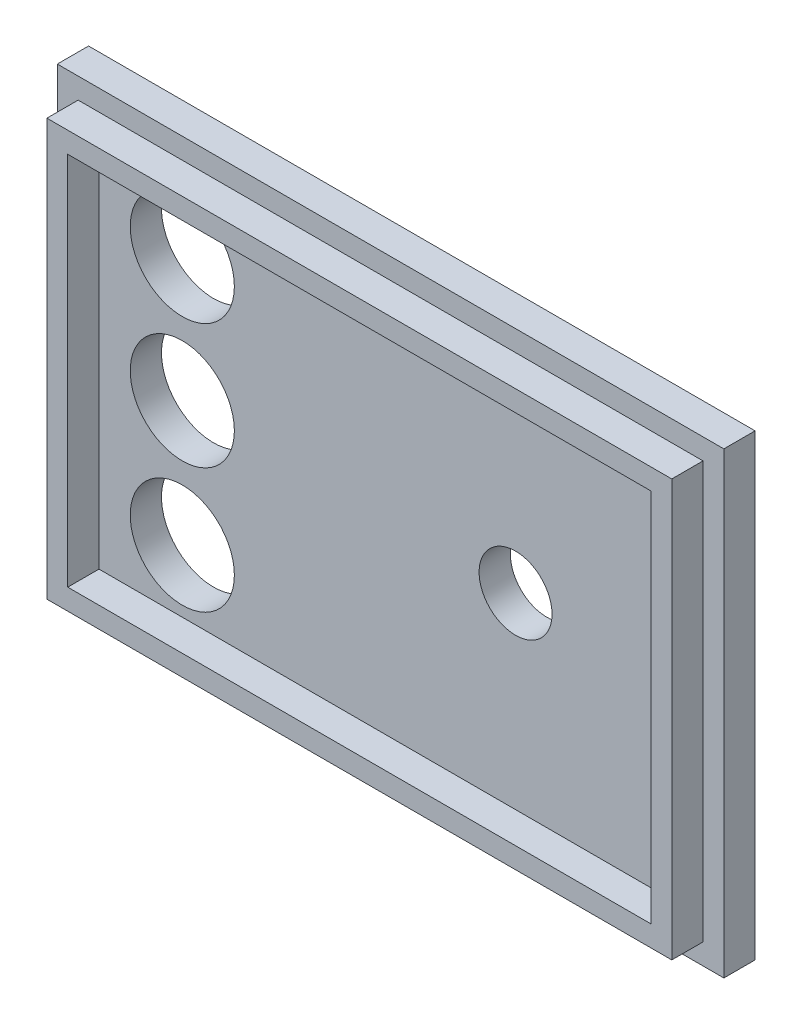
ISO-10303-21;
HEADER;
FILE_DESCRIPTION(('STEP AP214'),'2;1');
FILE_NAME('part.step','',(''),(''),'','','');
FILE_SCHEMA(('AUTOMOTIVE_DESIGN { 1 0 10303 214 1 1 1 1 }'));
ENDSEC;
DATA;
#1=APPLICATION_CONTEXT('core data for automotive mechanical design processes');
#2=APPLICATION_PROTOCOL_DEFINITION('international standard','automotive_design',2000,#1);
#3=PRODUCT_CONTEXT('',#1,'mechanical');
#4=PRODUCT('Part','Part','',(#3));
#5=PRODUCT_RELATED_PRODUCT_CATEGORY('part','',(#4));
#6=PRODUCT_DEFINITION_FORMATION('','',#4);
#7=PRODUCT_DEFINITION_CONTEXT('part definition',#1,'design');
#8=PRODUCT_DEFINITION('design','',#6,#7);
#9=PRODUCT_DEFINITION_SHAPE('','',#8);
#10=(LENGTH_UNIT() NAMED_UNIT(*) SI_UNIT(.MILLI.,.METRE.));
#11=(NAMED_UNIT(*) PLANE_ANGLE_UNIT() SI_UNIT($,.RADIAN.));
#12=(NAMED_UNIT(*) SI_UNIT($,.STERADIAN.) SOLID_ANGLE_UNIT());
#13=UNCERTAINTY_MEASURE_WITH_UNIT(LENGTH_MEASURE(1.E-05),#10,'distance_accuracy_value','');
#14=(GEOMETRIC_REPRESENTATION_CONTEXT(3) GLOBAL_UNCERTAINTY_ASSIGNED_CONTEXT((#13)) GLOBAL_UNIT_ASSIGNED_CONTEXT((#10,
#11,#12)) REPRESENTATION_CONTEXT('',''));
#15=CARTESIAN_POINT('',(0.,0.,0.));
#16=DIRECTION('',(0.,0.,1.));
#17=DIRECTION('',(1.,0.,0.));
#18=AXIS2_PLACEMENT_3D('',#15,#16,#17);
#19=CARTESIAN_POINT('',(0.,0.,3.));
#20=DIRECTION('',(0.,0.,1.));
#21=DIRECTION('',(1.,0.,0.));
#22=AXIS2_PLACEMENT_3D('',#19,#20,#21);
#23=PLANE('',#22);
#24=CARTESIAN_POINT('',(-20.,22.,3.));
#25=DIRECTION('',(0.,0.,1.));
#26=DIRECTION('',(1.,0.,0.));
#27=AXIS2_PLACEMENT_3D('',#24,#25,#26);
#28=CIRCLE('',#27,3.5);
#29=CARTESIAN_POINT('',(-16.5,22.,3.));
#30=VERTEX_POINT('',#29);
#31=EDGE_CURVE('E226',#30,#30,#28,.T.);
#32=ORIENTED_EDGE('',*,*,#31,.F.);
#33=EDGE_LOOP('',(#32));
#34=FACE_BOUND('',#33,.T.);
#35=CARTESIAN_POINT('',(-52.,22.,3.));
#36=DIRECTION('',(0.,0.,1.));
#37=DIRECTION('',(1.,0.,0.));
#38=AXIS2_PLACEMENT_3D('',#35,#36,#37);
#39=CIRCLE('',#38,5.);
#40=CARTESIAN_POINT('',(-47.,22.,3.));
#41=VERTEX_POINT('',#40);
#42=EDGE_CURVE('E242',#41,#41,#39,.T.);
#43=ORIENTED_EDGE('',*,*,#42,.F.);
#44=EDGE_LOOP('',(#43));
#45=FACE_BOUND('',#44,.T.);
#46=CARTESIAN_POINT('',(-52.,34.,3.));
#47=DIRECTION('',(0.,0.,1.));
#48=DIRECTION('',(1.,0.,0.));
#49=AXIS2_PLACEMENT_3D('',#46,#47,#48);
#50=CIRCLE('',#49,5.);
#51=CARTESIAN_POINT('',(-47.,34.,3.));
#52=VERTEX_POINT('',#51);
#53=EDGE_CURVE('E250',#52,#52,#50,.T.);
#54=ORIENTED_EDGE('',*,*,#53,.F.);
#55=EDGE_LOOP('',(#54));
#56=FACE_BOUND('',#55,.T.);
#57=CARTESIAN_POINT('',(-52.,9.99999999999999,3.));
#58=DIRECTION('',(0.,0.,1.));
#59=DIRECTION('',(1.,0.,0.));
#60=AXIS2_PLACEMENT_3D('',#57,#58,#59);
#61=CIRCLE('',#60,5.);
#62=CARTESIAN_POINT('',(-47.,9.99999999999999,3.));
#63=VERTEX_POINT('',#62);
#64=EDGE_CURVE('E234',#63,#63,#61,.T.);
#65=ORIENTED_EDGE('',*,*,#64,.F.);
#66=EDGE_LOOP('',(#65));
#67=FACE_BOUND('',#66,.T.);
#68=DIRECTION('',(-1.,0.,0.));
#69=VECTOR('',#68,1.);
#70=CARTESIAN_POINT('',(-60.,40.,3.));
#71=LINE('',#70,#69);
#72=CARTESIAN_POINT('',(-4.,40.,3.));
#73=VERTEX_POINT('',#72);
#74=CARTESIAN_POINT('',(-60.,40.,3.));
#75=VERTEX_POINT('',#74);
#76=EDGE_CURVE('E144',#73,#75,#71,.T.);
#77=ORIENTED_EDGE('',*,*,#76,.T.);
#78=DIRECTION('',(0.,-1.,0.));
#79=VECTOR('',#78,1.);
#80=CARTESIAN_POINT('',(-60.,40.,3.));
#81=LINE('',#80,#79);
#82=CARTESIAN_POINT('',(-60.,3.99999999999999,3.));
#83=VERTEX_POINT('',#82);
#84=EDGE_CURVE('E166',#75,#83,#81,.T.);
#85=ORIENTED_EDGE('',*,*,#84,.T.);
#86=DIRECTION('',(1.,0.,0.));
#87=VECTOR('',#86,1.);
#88=CARTESIAN_POINT('',(-60.,3.99999999999999,3.));
#89=LINE('',#88,#87);
#90=CARTESIAN_POINT('',(-3.99999999999999,3.99999999999999,3.));
#91=VERTEX_POINT('',#90);
#92=EDGE_CURVE('E150',#83,#91,#89,.T.);
#93=ORIENTED_EDGE('',*,*,#92,.T.);
#94=DIRECTION('',(0.,1.,0.));
#95=VECTOR('',#94,1.);
#96=CARTESIAN_POINT('',(-4.,40.,3.));
#97=LINE('',#96,#95);
#98=EDGE_CURVE('E171',#91,#73,#97,.T.);
#99=ORIENTED_EDGE('',*,*,#98,.T.);
#100=EDGE_LOOP('',(#77,#85,#93,#99));
#101=FACE_BOUND('',#100,.T.);
#102=ADVANCED_FACE('F43',(#34,#45,#56,#67,#101),#23,.T.);
#103=DIRECTION('',(0.,-1.,0.));
#104=VECTOR('',#103,1.);
#105=CARTESIAN_POINT('',(-62.,42.,3.));
#106=LINE('',#105,#104);
#107=CARTESIAN_POINT('',(-62.,42.,3.));
#108=VERTEX_POINT('',#107);
#109=CARTESIAN_POINT('',(-62.,1.99999999999998,3.));
#110=VERTEX_POINT('',#109);
#111=EDGE_CURVE('E59',#108,#110,#106,.T.);
#112=ORIENTED_EDGE('',*,*,#111,.F.);
#113=DIRECTION('',(-1.,0.,0.));
#114=VECTOR('',#113,1.);
#115=CARTESIAN_POINT('',(-62.,42.,3.));
#116=LINE('',#115,#114);
#117=CARTESIAN_POINT('',(-2.,42.,3.));
#118=VERTEX_POINT('',#117);
#119=EDGE_CURVE('E63',#118,#108,#116,.T.);
#120=ORIENTED_EDGE('',*,*,#119,.F.);
#121=DIRECTION('',(0.,1.,0.));
#122=VECTOR('',#121,1.);
#123=CARTESIAN_POINT('',(-2.,42.,3.));
#124=LINE('',#123,#122);
#125=CARTESIAN_POINT('',(-1.99999999999999,1.99999999999998,3.));
#126=VERTEX_POINT('',#125);
#127=EDGE_CURVE('E205',#126,#118,#124,.T.);
#128=ORIENTED_EDGE('',*,*,#127,.F.);
#129=DIRECTION('',(1.,0.,0.));
#130=VECTOR('',#129,1.);
#131=CARTESIAN_POINT('',(-62.,1.99999999999998,3.));
#132=LINE('',#131,#130);
#133=EDGE_CURVE('E201',#110,#126,#132,.T.);
#134=ORIENTED_EDGE('',*,*,#133,.F.);
#135=EDGE_LOOP('',(#112,#120,#128,#134));
#136=FACE_BOUND('',#135,.T.);
#137=DIRECTION('',(0.,1.,0.));
#138=VECTOR('',#137,1.);
#139=CARTESIAN_POINT('',(0.,0.,3.));
#140=LINE('',#139,#138);
#141=CARTESIAN_POINT('',(0.,0.,3.));
#142=VERTEX_POINT('',#141);
#143=CARTESIAN_POINT('',(0.,44.,3.));
#144=VERTEX_POINT('',#143);
#145=EDGE_CURVE('E258',#142,#144,#140,.T.);
#146=ORIENTED_EDGE('',*,*,#145,.T.);
#147=DIRECTION('',(-1.,0.,0.));
#148=VECTOR('',#147,1.);
#149=CARTESIAN_POINT('',(0.,44.,3.));
#150=LINE('',#149,#148);
#151=CARTESIAN_POINT('',(-64.,44.,3.));
#152=VERTEX_POINT('',#151);
#153=EDGE_CURVE('E262',#144,#152,#150,.T.);
#154=ORIENTED_EDGE('',*,*,#153,.T.);
#155=DIRECTION('',(0.,-1.,0.));
#156=VECTOR('',#155,1.);
#157=CARTESIAN_POINT('',(-64.,0.,3.));
#158=LINE('',#157,#156);
#159=CARTESIAN_POINT('',(-64.,0.,3.));
#160=VERTEX_POINT('',#159);
#161=EDGE_CURVE('E266',#152,#160,#158,.T.);
#162=ORIENTED_EDGE('',*,*,#161,.T.);
#163=DIRECTION('',(1.,0.,0.));
#164=VECTOR('',#163,1.);
#165=CARTESIAN_POINT('',(0.,0.,3.));
#166=LINE('',#165,#164);
#167=EDGE_CURVE('E269',#160,#142,#166,.T.);
#168=ORIENTED_EDGE('',*,*,#167,.T.);
#169=EDGE_LOOP('',(#146,#154,#162,#168));
#170=FACE_BOUND('',#169,.T.);
#171=ADVANCED_FACE('F312',(#136,#170),#23,.T.);
#172=CARTESIAN_POINT('',(0.,0.,0.));
#173=DIRECTION('',(0.,0.,1.));
#174=DIRECTION('',(1.,0.,0.));
#175=AXIS2_PLACEMENT_3D('',#172,#173,#174);
#176=PLANE('',#175);
#177=DIRECTION('',(0.,1.,0.));
#178=VECTOR('',#177,1.);
#179=CARTESIAN_POINT('',(0.,0.,0.));
#180=LINE('',#179,#178);
#181=CARTESIAN_POINT('',(0.,0.,0.));
#182=VERTEX_POINT('',#181);
#183=CARTESIAN_POINT('',(0.,44.,0.));
#184=VERTEX_POINT('',#183);
#185=EDGE_CURVE('E254',#182,#184,#180,.T.);
#186=ORIENTED_EDGE('',*,*,#185,.F.);
#187=DIRECTION('',(1.,0.,0.));
#188=VECTOR('',#187,1.);
#189=CARTESIAN_POINT('',(0.,0.,0.));
#190=LINE('',#189,#188);
#191=CARTESIAN_POINT('',(-64.,0.,0.));
#192=VERTEX_POINT('',#191);
#193=EDGE_CURVE('E263',#192,#182,#190,.T.);
#194=ORIENTED_EDGE('',*,*,#193,.F.);
#195=DIRECTION('',(0.,-1.,0.));
#196=VECTOR('',#195,1.);
#197=CARTESIAN_POINT('',(-64.,0.,0.));
#198=LINE('',#197,#196);
#199=CARTESIAN_POINT('',(-64.,44.,0.));
#200=VERTEX_POINT('',#199);
#201=EDGE_CURVE('E279',#200,#192,#198,.T.);
#202=ORIENTED_EDGE('',*,*,#201,.F.);
#203=DIRECTION('',(-1.,0.,0.));
#204=VECTOR('',#203,1.);
#205=CARTESIAN_POINT('',(0.,44.,0.));
#206=LINE('',#205,#204);
#207=EDGE_CURVE('E276',#184,#200,#206,.T.);
#208=ORIENTED_EDGE('',*,*,#207,.F.);
#209=EDGE_LOOP('',(#186,#194,#202,#208));
#210=FACE_BOUND('',#209,.T.);
#211=CARTESIAN_POINT('',(-52.,34.,0.));
#212=DIRECTION('',(0.,0.,1.));
#213=DIRECTION('',(1.,0.,0.));
#214=AXIS2_PLACEMENT_3D('',#211,#212,#213);
#215=CIRCLE('',#214,5.);
#216=CARTESIAN_POINT('',(-47.,34.,0.));
#217=VERTEX_POINT('',#216);
#218=EDGE_CURVE('E246',#217,#217,#215,.T.);
#219=ORIENTED_EDGE('',*,*,#218,.T.);
#220=EDGE_LOOP('',(#219));
#221=FACE_BOUND('',#220,.T.);
#222=CARTESIAN_POINT('',(-52.,22.,0.));
#223=DIRECTION('',(0.,0.,1.));
#224=DIRECTION('',(1.,0.,0.));
#225=AXIS2_PLACEMENT_3D('',#222,#223,#224);
#226=CIRCLE('',#225,5.);
#227=CARTESIAN_POINT('',(-47.,22.,0.));
#228=VERTEX_POINT('',#227);
#229=EDGE_CURVE('E238',#228,#228,#226,.T.);
#230=ORIENTED_EDGE('',*,*,#229,.T.);
#231=EDGE_LOOP('',(#230));
#232=FACE_BOUND('',#231,.T.);
#233=CARTESIAN_POINT('',(-52.,9.99999999999999,0.));
#234=DIRECTION('',(0.,0.,1.));
#235=DIRECTION('',(1.,0.,0.));
#236=AXIS2_PLACEMENT_3D('',#233,#234,#235);
#237=CIRCLE('',#236,5.);
#238=CARTESIAN_POINT('',(-47.,9.99999999999999,0.));
#239=VERTEX_POINT('',#238);
#240=EDGE_CURVE('E230',#239,#239,#237,.T.);
#241=ORIENTED_EDGE('',*,*,#240,.T.);
#242=EDGE_LOOP('',(#241));
#243=FACE_BOUND('',#242,.T.);
#244=CARTESIAN_POINT('',(-20.,22.,0.));
#245=DIRECTION('',(0.,0.,1.));
#246=DIRECTION('',(1.,0.,0.));
#247=AXIS2_PLACEMENT_3D('',#244,#245,#246);
#248=CIRCLE('',#247,3.5);
#249=CARTESIAN_POINT('',(-16.5,22.,0.));
#250=VERTEX_POINT('',#249);
#251=EDGE_CURVE('E225',#250,#250,#248,.T.);
#252=ORIENTED_EDGE('',*,*,#251,.T.);
#253=EDGE_LOOP('',(#252));
#254=FACE_BOUND('',#253,.T.);
#255=ADVANCED_FACE('F302',(#210,#221,#232,#243,#254),#176,.F.);
#256=CARTESIAN_POINT('',(0.,0.,3.));
#257=DIRECTION('',(-1.,0.,0.));
#258=DIRECTION('',(0.,0.,1.));
#259=AXIS2_PLACEMENT_3D('',#256,#257,#258);
#260=PLANE('',#259);
#261=ORIENTED_EDGE('',*,*,#185,.T.);
#262=DIRECTION('',(0.,0.,-1.));
#263=VECTOR('',#262,1.);
#264=CARTESIAN_POINT('',(0.,44.,3.));
#265=LINE('',#264,#263);
#266=EDGE_CURVE('E11',#144,#184,#265,.T.);
#267=ORIENTED_EDGE('',*,*,#266,.F.);
#268=ORIENTED_EDGE('',*,*,#145,.F.);
#269=DIRECTION('',(0.,0.,-1.));
#270=VECTOR('',#269,1.);
#271=CARTESIAN_POINT('',(0.,0.,3.));
#272=LINE('',#271,#270);
#273=EDGE_CURVE('E272',#142,#182,#272,.T.);
#274=ORIENTED_EDGE('',*,*,#273,.T.);
#275=EDGE_LOOP('',(#261,#267,#268,#274));
#276=FACE_BOUND('',#275,.T.);
#277=ADVANCED_FACE('F45',(#276),#260,.F.);
#278=CARTESIAN_POINT('',(0.,44.,3.));
#279=DIRECTION('',(0.,-1.,0.));
#280=DIRECTION('',(1.,0.,0.));
#281=AXIS2_PLACEMENT_3D('',#278,#279,#280);
#282=PLANE('',#281);
#283=ORIENTED_EDGE('',*,*,#207,.T.);
#284=DIRECTION('',(0.,0.,-1.));
#285=VECTOR('',#284,1.);
#286=CARTESIAN_POINT('',(-64.,44.,3.));
#287=LINE('',#286,#285);
#288=EDGE_CURVE('E52',#152,#200,#287,.T.);
#289=ORIENTED_EDGE('',*,*,#288,.F.);
#290=ORIENTED_EDGE('',*,*,#153,.F.);
#291=ORIENTED_EDGE('',*,*,#266,.T.);
#292=EDGE_LOOP('',(#283,#289,#290,#291));
#293=FACE_BOUND('',#292,.T.);
#294=ADVANCED_FACE('F313',(#293),#282,.F.);
#295=CARTESIAN_POINT('',(-64.,0.,3.));
#296=DIRECTION('',(1.,0.,0.));
#297=DIRECTION('',(0.,0.,-1.));
#298=AXIS2_PLACEMENT_3D('',#295,#296,#297);
#299=PLANE('',#298);
#300=ORIENTED_EDGE('',*,*,#201,.T.);
#301=DIRECTION('',(0.,0.,-1.));
#302=VECTOR('',#301,1.);
#303=CARTESIAN_POINT('',(-64.,0.,3.));
#304=LINE('',#303,#302);
#305=EDGE_CURVE('E287',#160,#192,#304,.T.);
#306=ORIENTED_EDGE('',*,*,#305,.F.);
#307=ORIENTED_EDGE('',*,*,#161,.F.);
#308=ORIENTED_EDGE('',*,*,#288,.T.);
#309=EDGE_LOOP('',(#300,#306,#307,#308));
#310=FACE_BOUND('',#309,.T.);
#311=ADVANCED_FACE('F296',(#310),#299,.F.);
#312=CARTESIAN_POINT('',(0.,0.,3.));
#313=DIRECTION('',(0.,1.,0.));
#314=DIRECTION('',(-1.,0.,0.));
#315=AXIS2_PLACEMENT_3D('',#312,#313,#314);
#316=PLANE('',#315);
#317=ORIENTED_EDGE('',*,*,#193,.T.);
#318=ORIENTED_EDGE('',*,*,#273,.F.);
#319=ORIENTED_EDGE('',*,*,#167,.F.);
#320=ORIENTED_EDGE('',*,*,#305,.T.);
#321=EDGE_LOOP('',(#317,#318,#319,#320));
#322=FACE_BOUND('',#321,.T.);
#323=ADVANCED_FACE('F306',(#322),#316,.F.);
#324=CARTESIAN_POINT('',(-52.,34.,3.));
#325=DIRECTION('',(0.,0.,-1.));
#326=DIRECTION('',(-1.,0.,0.));
#327=AXIS2_PLACEMENT_3D('',#324,#325,#326);
#328=CYLINDRICAL_SURFACE('',#327,5.);
#329=ORIENTED_EDGE('',*,*,#53,.T.);
#330=EDGE_LOOP('',(#329));
#331=FACE_BOUND('',#330,.T.);
#332=ORIENTED_EDGE('',*,*,#218,.F.);
#333=EDGE_LOOP('',(#332));
#334=FACE_BOUND('',#333,.T.);
#335=ADVANCED_FACE('F330',(#331,#334),#328,.F.);
#336=CARTESIAN_POINT('',(-52.,22.,3.));
#337=DIRECTION('',(0.,0.,-1.));
#338=DIRECTION('',(-1.,0.,0.));
#339=AXIS2_PLACEMENT_3D('',#336,#337,#338);
#340=CYLINDRICAL_SURFACE('',#339,5.);
#341=ORIENTED_EDGE('',*,*,#42,.T.);
#342=EDGE_LOOP('',(#341));
#343=FACE_BOUND('',#342,.T.);
#344=ORIENTED_EDGE('',*,*,#229,.F.);
#345=EDGE_LOOP('',(#344));
#346=FACE_BOUND('',#345,.T.);
#347=ADVANCED_FACE('F338',(#343,#346),#340,.F.);
#348=CARTESIAN_POINT('',(-52.,9.99999999999999,3.));
#349=DIRECTION('',(0.,0.,-1.));
#350=DIRECTION('',(-1.,0.,0.));
#351=AXIS2_PLACEMENT_3D('',#348,#349,#350);
#352=CYLINDRICAL_SURFACE('',#351,5.);
#353=ORIENTED_EDGE('',*,*,#64,.T.);
#354=EDGE_LOOP('',(#353));
#355=FACE_BOUND('',#354,.T.);
#356=ORIENTED_EDGE('',*,*,#240,.F.);
#357=EDGE_LOOP('',(#356));
#358=FACE_BOUND('',#357,.T.);
#359=ADVANCED_FACE('F343',(#355,#358),#352,.F.);
#360=CARTESIAN_POINT('',(-20.,22.,3.));
#361=DIRECTION('',(0.,0.,-1.));
#362=DIRECTION('',(-1.,0.,0.));
#363=AXIS2_PLACEMENT_3D('',#360,#361,#362);
#364=CYLINDRICAL_SURFACE('',#363,3.5);
#365=ORIENTED_EDGE('',*,*,#31,.T.);
#366=EDGE_LOOP('',(#365));
#367=FACE_BOUND('',#366,.T.);
#368=ORIENTED_EDGE('',*,*,#251,.F.);
#369=EDGE_LOOP('',(#368));
#370=FACE_BOUND('',#369,.T.);
#371=ADVANCED_FACE('F355',(#367,#370),#364,.F.);
#372=CARTESIAN_POINT('',(0.,0.,6.));
#373=DIRECTION('',(0.,0.,1.));
#374=DIRECTION('',(1.,0.,0.));
#375=AXIS2_PLACEMENT_3D('',#372,#373,#374);
#376=PLANE('',#375);
#377=DIRECTION('',(0.,-1.,0.));
#378=VECTOR('',#377,1.);
#379=CARTESIAN_POINT('',(-62.,42.,6.));
#380=LINE('',#379,#378);
#381=CARTESIAN_POINT('',(-62.,42.,6.));
#382=VERTEX_POINT('',#381);
#383=CARTESIAN_POINT('',(-62.,1.99999999999998,6.));
#384=VERTEX_POINT('',#383);
#385=EDGE_CURVE('E185',#382,#384,#380,.T.);
#386=ORIENTED_EDGE('',*,*,#385,.T.);
#387=DIRECTION('',(1.,0.,0.));
#388=VECTOR('',#387,1.);
#389=CARTESIAN_POINT('',(-62.,1.99999999999998,6.));
#390=LINE('',#389,#388);
#391=CARTESIAN_POINT('',(-1.99999999999999,1.99999999999998,6.));
#392=VERTEX_POINT('',#391);
#393=EDGE_CURVE('E189',#384,#392,#390,.T.);
#394=ORIENTED_EDGE('',*,*,#393,.T.);
#395=DIRECTION('',(0.,1.,0.));
#396=VECTOR('',#395,1.);
#397=CARTESIAN_POINT('',(-2.,42.,6.));
#398=LINE('',#397,#396);
#399=CARTESIAN_POINT('',(-2.,42.,6.));
#400=VERTEX_POINT('',#399);
#401=EDGE_CURVE('E192',#392,#400,#398,.T.);
#402=ORIENTED_EDGE('',*,*,#401,.T.);
#403=DIRECTION('',(-1.,0.,0.));
#404=VECTOR('',#403,1.);
#405=CARTESIAN_POINT('',(-62.,42.,6.));
#406=LINE('',#405,#404);
#407=EDGE_CURVE('E195',#400,#382,#406,.T.);
#408=ORIENTED_EDGE('',*,*,#407,.T.);
#409=EDGE_LOOP('',(#386,#394,#402,#408));
#410=FACE_BOUND('',#409,.T.);
#411=DIRECTION('',(1.,0.,0.));
#412=VECTOR('',#411,1.);
#413=CARTESIAN_POINT('',(-60.,3.99999999999999,6.));
#414=LINE('',#413,#412);
#415=CARTESIAN_POINT('',(-60.,3.99999999999999,6.));
#416=VERTEX_POINT('',#415);
#417=CARTESIAN_POINT('',(-3.99999999999999,3.99999999999999,6.));
#418=VERTEX_POINT('',#417);
#419=EDGE_CURVE('E143',#416,#418,#414,.T.);
#420=ORIENTED_EDGE('',*,*,#419,.F.);
#421=DIRECTION('',(0.,-1.,0.));
#422=VECTOR('',#421,1.);
#423=CARTESIAN_POINT('',(-60.,40.,6.));
#424=LINE('',#423,#422);
#425=CARTESIAN_POINT('',(-60.,40.,6.));
#426=VERTEX_POINT('',#425);
#427=EDGE_CURVE('E132',#426,#416,#424,.T.);
#428=ORIENTED_EDGE('',*,*,#427,.F.);
#429=DIRECTION('',(-1.,0.,0.));
#430=VECTOR('',#429,1.);
#431=CARTESIAN_POINT('',(-60.,40.,6.));
#432=LINE('',#431,#430);
#433=CARTESIAN_POINT('',(-4.,40.,6.));
#434=VERTEX_POINT('',#433);
#435=EDGE_CURVE('E161',#434,#426,#432,.T.);
#436=ORIENTED_EDGE('',*,*,#435,.F.);
#437=DIRECTION('',(0.,1.,0.));
#438=VECTOR('',#437,1.);
#439=CARTESIAN_POINT('',(-4.,40.,6.));
#440=LINE('',#439,#438);
#441=EDGE_CURVE('E157',#418,#434,#440,.T.);
#442=ORIENTED_EDGE('',*,*,#441,.F.);
#443=EDGE_LOOP('',(#420,#428,#436,#442));
#444=FACE_BOUND('',#443,.T.);
#445=ADVANCED_FACE('F155',(#410,#444),#376,.T.);
#446=CARTESIAN_POINT('',(-62.,42.,6.));
#447=DIRECTION('',(1.,0.,0.));
#448=DIRECTION('',(0.,1.,0.));
#449=AXIS2_PLACEMENT_3D('',#446,#447,#448);
#450=PLANE('',#449);
#451=ORIENTED_EDGE('',*,*,#111,.T.);
#452=DIRECTION('',(0.,0.,-1.));
#453=VECTOR('',#452,1.);
#454=CARTESIAN_POINT('',(-62.,1.99999999999998,6.));
#455=LINE('',#454,#453);
#456=EDGE_CURVE('E221',#384,#110,#455,.T.);
#457=ORIENTED_EDGE('',*,*,#456,.F.);
#458=ORIENTED_EDGE('',*,*,#385,.F.);
#459=DIRECTION('',(0.,0.,-1.));
#460=VECTOR('',#459,1.);
#461=CARTESIAN_POINT('',(-62.,42.,6.));
#462=LINE('',#461,#460);
#463=EDGE_CURVE('E198',#382,#108,#462,.T.);
#464=ORIENTED_EDGE('',*,*,#463,.T.);
#465=EDGE_LOOP('',(#451,#457,#458,#464));
#466=FACE_BOUND('',#465,.T.);
#467=ADVANCED_FACE('F363',(#466),#450,.F.);
#468=CARTESIAN_POINT('',(-62.,1.99999999999998,6.));
#469=DIRECTION('',(0.,1.,0.));
#470=DIRECTION('',(0.,0.,1.));
#471=AXIS2_PLACEMENT_3D('',#468,#469,#470);
#472=PLANE('',#471);
#473=ORIENTED_EDGE('',*,*,#133,.T.);
#474=DIRECTION('',(0.,0.,-1.));
#475=VECTOR('',#474,1.);
#476=CARTESIAN_POINT('',(-1.99999999999999,1.99999999999998,6.));
#477=LINE('',#476,#475);
#478=EDGE_CURVE('E217',#392,#126,#477,.T.);
#479=ORIENTED_EDGE('',*,*,#478,.F.);
#480=ORIENTED_EDGE('',*,*,#393,.F.);
#481=ORIENTED_EDGE('',*,*,#456,.T.);
#482=EDGE_LOOP('',(#473,#479,#480,#481));
#483=FACE_BOUND('',#482,.T.);
#484=ADVANCED_FACE('F371',(#483),#472,.F.);
#485=CARTESIAN_POINT('',(-2.,42.,6.));
#486=DIRECTION('',(-1.,0.,0.));
#487=DIRECTION('',(0.,-1.,0.));
#488=AXIS2_PLACEMENT_3D('',#485,#486,#487);
#489=PLANE('',#488);
#490=ORIENTED_EDGE('',*,*,#127,.T.);
#491=DIRECTION('',(0.,0.,-1.));
#492=VECTOR('',#491,1.);
#493=CARTESIAN_POINT('',(-2.,42.,6.));
#494=LINE('',#493,#492);
#495=EDGE_CURVE('E213',#400,#118,#494,.T.);
#496=ORIENTED_EDGE('',*,*,#495,.F.);
#497=ORIENTED_EDGE('',*,*,#401,.F.);
#498=ORIENTED_EDGE('',*,*,#478,.T.);
#499=EDGE_LOOP('',(#490,#496,#497,#498));
#500=FACE_BOUND('',#499,.T.);
#501=ADVANCED_FACE('F375',(#500),#489,.F.);
#502=CARTESIAN_POINT('',(-62.,42.,6.));
#503=DIRECTION('',(0.,-1.,0.));
#504=DIRECTION('',(1.,0.,0.));
#505=AXIS2_PLACEMENT_3D('',#502,#503,#504);
#506=PLANE('',#505);
#507=ORIENTED_EDGE('',*,*,#119,.T.);
#508=ORIENTED_EDGE('',*,*,#463,.F.);
#509=ORIENTED_EDGE('',*,*,#407,.F.);
#510=ORIENTED_EDGE('',*,*,#495,.T.);
#511=EDGE_LOOP('',(#507,#508,#509,#510));
#512=FACE_BOUND('',#511,.T.);
#513=ADVANCED_FACE('F379',(#512),#506,.F.);
#514=CARTESIAN_POINT('',(-60.,40.,6.));
#515=DIRECTION('',(1.,0.,0.));
#516=DIRECTION('',(0.,1.,0.));
#517=AXIS2_PLACEMENT_3D('',#514,#515,#516);
#518=PLANE('',#517);
#519=ORIENTED_EDGE('',*,*,#84,.F.);
#520=DIRECTION('',(0.,0.,-1.));
#521=VECTOR('',#520,1.);
#522=CARTESIAN_POINT('',(-60.,40.,6.));
#523=LINE('',#522,#521);
#524=EDGE_CURVE('E138',#426,#75,#523,.T.);
#525=ORIENTED_EDGE('',*,*,#524,.F.);
#526=ORIENTED_EDGE('',*,*,#427,.T.);
#527=DIRECTION('',(0.,0.,-1.));
#528=VECTOR('',#527,1.);
#529=CARTESIAN_POINT('',(-60.,3.99999999999999,6.));
#530=LINE('',#529,#528);
#531=EDGE_CURVE('E136',#416,#83,#530,.T.);
#532=ORIENTED_EDGE('',*,*,#531,.T.);
#533=EDGE_LOOP('',(#519,#525,#526,#532));
#534=FACE_BOUND('',#533,.T.);
#535=ADVANCED_FACE('F135',(#534),#518,.T.);
#536=CARTESIAN_POINT('',(-60.,3.99999999999999,6.));
#537=DIRECTION('',(0.,1.,0.));
#538=DIRECTION('',(-1.,0.,0.));
#539=AXIS2_PLACEMENT_3D('',#536,#537,#538);
#540=PLANE('',#539);
#541=ORIENTED_EDGE('',*,*,#92,.F.);
#542=ORIENTED_EDGE('',*,*,#531,.F.);
#543=ORIENTED_EDGE('',*,*,#419,.T.);
#544=DIRECTION('',(0.,0.,-1.));
#545=VECTOR('',#544,1.);
#546=CARTESIAN_POINT('',(-3.99999999999999,3.99999999999999,6.));
#547=LINE('',#546,#545);
#548=EDGE_CURVE('E152',#418,#91,#547,.T.);
#549=ORIENTED_EDGE('',*,*,#548,.T.);
#550=EDGE_LOOP('',(#541,#542,#543,#549));
#551=FACE_BOUND('',#550,.T.);
#552=ADVANCED_FACE('F147',(#551),#540,.T.);
#553=CARTESIAN_POINT('',(-4.,40.,6.));
#554=DIRECTION('',(-1.,0.,0.));
#555=DIRECTION('',(0.,-1.,0.));
#556=AXIS2_PLACEMENT_3D('',#553,#554,#555);
#557=PLANE('',#556);
#558=ORIENTED_EDGE('',*,*,#98,.F.);
#559=ORIENTED_EDGE('',*,*,#548,.F.);
#560=ORIENTED_EDGE('',*,*,#441,.T.);
#561=DIRECTION('',(0.,0.,-1.));
#562=VECTOR('',#561,1.);
#563=CARTESIAN_POINT('',(-4.,40.,6.));
#564=LINE('',#563,#562);
#565=EDGE_CURVE('E180',#434,#73,#564,.T.);
#566=ORIENTED_EDGE('',*,*,#565,.T.);
#567=EDGE_LOOP('',(#558,#559,#560,#566));
#568=FACE_BOUND('',#567,.T.);
#569=ADVANCED_FACE('F388',(#568),#557,.T.);
#570=CARTESIAN_POINT('',(-60.,40.,6.));
#571=DIRECTION('',(0.,-1.,0.));
#572=DIRECTION('',(1.,0.,0.));
#573=AXIS2_PLACEMENT_3D('',#570,#571,#572);
#574=PLANE('',#573);
#575=ORIENTED_EDGE('',*,*,#76,.F.);
#576=ORIENTED_EDGE('',*,*,#565,.F.);
#577=ORIENTED_EDGE('',*,*,#435,.T.);
#578=ORIENTED_EDGE('',*,*,#524,.T.);
#579=EDGE_LOOP('',(#575,#576,#577,#578));
#580=FACE_BOUND('',#579,.T.);
#581=ADVANCED_FACE('F391',(#580),#574,.T.);
#582=CLOSED_SHELL('',(#102,#171,#255,#277,#294,#311,#323,#335,#347,#359,#371,#445,#467,#484,
#501,#513,#535,#552,#569,#581));
#583=MANIFOLD_SOLID_BREP('B2',#582);
#584=ADVANCED_BREP_SHAPE_REPRESENTATION('',(#18,#583),#14);
#585=SHAPE_DEFINITION_REPRESENTATION(#9,#584);
ENDSEC;
END-ISO-10303-21;
